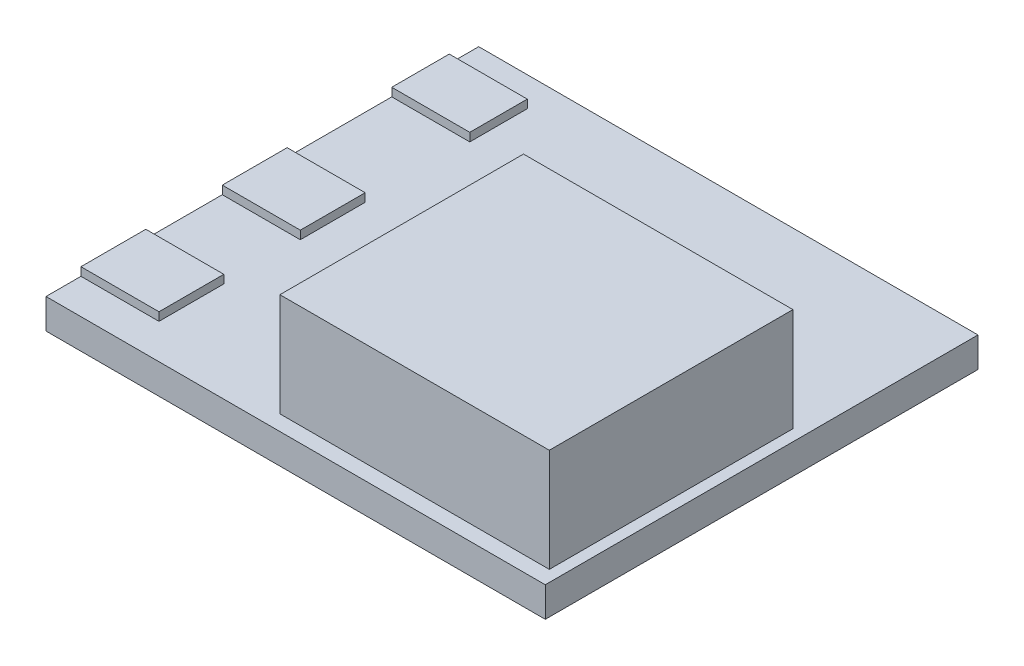
ISO-10303-21;
HEADER;
FILE_DESCRIPTION(('STEP AP214'),'2;1');
FILE_NAME('part.step','',(''),(''),'','','');
FILE_SCHEMA(('AUTOMOTIVE_DESIGN { 1 0 10303 214 1 1 1 1 }'));
ENDSEC;
DATA;
#1=APPLICATION_CONTEXT('core data for automotive mechanical design processes');
#2=APPLICATION_PROTOCOL_DEFINITION('international standard','automotive_design',2000,#1);
#3=PRODUCT_CONTEXT('',#1,'mechanical');
#4=PRODUCT('Part','Part','',(#3));
#5=PRODUCT_RELATED_PRODUCT_CATEGORY('part','',(#4));
#6=PRODUCT_DEFINITION_FORMATION('','',#4);
#7=PRODUCT_DEFINITION_CONTEXT('part definition',#1,'design');
#8=PRODUCT_DEFINITION('design','',#6,#7);
#9=PRODUCT_DEFINITION_SHAPE('','',#8);
#10=(LENGTH_UNIT() NAMED_UNIT(*) SI_UNIT(.MILLI.,.METRE.));
#11=(NAMED_UNIT(*) PLANE_ANGLE_UNIT() SI_UNIT($,.RADIAN.));
#12=(NAMED_UNIT(*) SI_UNIT($,.STERADIAN.) SOLID_ANGLE_UNIT());
#13=UNCERTAINTY_MEASURE_WITH_UNIT(LENGTH_MEASURE(1.E-05),#10,'distance_accuracy_value','');
#14=(GEOMETRIC_REPRESENTATION_CONTEXT(3) GLOBAL_UNCERTAINTY_ASSIGNED_CONTEXT((#13)) GLOBAL_UNIT_ASSIGNED_CONTEXT((#10,
#11,#12)) REPRESENTATION_CONTEXT('',''));
#15=CARTESIAN_POINT('',(0.,0.,0.));
#16=DIRECTION('',(0.,0.,1.));
#17=DIRECTION('',(1.,0.,0.));
#18=AXIS2_PLACEMENT_3D('',#15,#16,#17);
#19=CARTESIAN_POINT('',(0.,1.8,0.));
#20=DIRECTION('',(0.,1.,0.));
#21=DIRECTION('',(0.,0.,1.));
#22=AXIS2_PLACEMENT_3D('',#19,#20,#21);
#23=PLANE('',#22);
#24=DIRECTION('',(0.,0.,1.));
#25=VECTOR('',#24,1.);
#26=CARTESIAN_POINT('',(13.1340872374798,1.8,0.));
#27=LINE('',#26,#25);
#28=CARTESIAN_POINT('',(13.1340872374798,1.8,-15.5573505654281));
#29=VERTEX_POINT('',#28);
#30=CARTESIAN_POINT('',(13.1340872374798,1.8,-0.920840064620357));
#31=VERTEX_POINT('',#30);
#32=EDGE_CURVE('E289',#29,#31,#27,.T.);
#33=ORIENTED_EDGE('',*,*,#32,.F.);
#34=DIRECTION('',(1.,0.,0.));
#35=VECTOR('',#34,1.);
#36=CARTESIAN_POINT('',(0.,1.8,-15.5573505654281));
#37=LINE('',#36,#35);
#38=CARTESIAN_POINT('',(29.3214862681745,1.8,-15.5573505654281));
#39=VERTEX_POINT('',#38);
#40=EDGE_CURVE('E281',#29,#39,#37,.T.);
#41=ORIENTED_EDGE('',*,*,#40,.T.);
#42=DIRECTION('',(0.,0.,1.));
#43=VECTOR('',#42,1.);
#44=CARTESIAN_POINT('',(29.3214862681745,1.8,0.));
#45=LINE('',#44,#43);
#46=CARTESIAN_POINT('',(29.3214862681745,1.8,-0.920840064620357));
#47=VERTEX_POINT('',#46);
#48=EDGE_CURVE('E284',#39,#47,#45,.T.);
#49=ORIENTED_EDGE('',*,*,#48,.T.);
#50=DIRECTION('',(1.,0.,0.));
#51=VECTOR('',#50,1.);
#52=CARTESIAN_POINT('',(0.,1.8,-0.920840064620357));
#53=LINE('',#52,#51);
#54=EDGE_CURVE('E287',#31,#47,#53,.T.);
#55=ORIENTED_EDGE('',*,*,#54,.F.);
#56=EDGE_LOOP('',(#33,#41,#49,#55));
#57=FACE_BOUND('',#56,.T.);
#58=DIRECTION('',(0.,0.,-1.));
#59=VECTOR('',#58,1.);
#60=CARTESIAN_POINT('',(4.68829278157379,1.8,-24.2307542075907));
#61=LINE('',#60,#59);
#62=CARTESIAN_POINT('',(4.68829278157379,1.8,-20.775137528332));
#63=VERTEX_POINT('',#62);
#64=CARTESIAN_POINT('',(4.68829278157379,1.8,-24.2307542075907));
#65=VERTEX_POINT('',#64);
#66=EDGE_CURVE('E546',#63,#65,#61,.T.);
#67=ORIENTED_EDGE('',*,*,#66,.F.);
#68=DIRECTION('',(1.,0.,0.));
#69=VECTOR('',#68,1.);
#70=CARTESIAN_POINT('',(0.,1.8,-20.775137528332));
#71=LINE('',#70,#69);
#72=CARTESIAN_POINT('',(0.,1.8,-20.775137528332));
#73=VERTEX_POINT('',#72);
#74=EDGE_CURVE('E231',#73,#63,#71,.T.);
#75=ORIENTED_EDGE('',*,*,#74,.F.);
#76=DIRECTION('',(0.,0.,-1.));
#77=VECTOR('',#76,1.);
#78=CARTESIAN_POINT('',(0.,1.8,0.));
#79=LINE('',#78,#77);
#80=CARTESIAN_POINT('',(0.,1.8,-14.4888561224465));
#81=VERTEX_POINT('',#80);
#82=EDGE_CURVE('E205',#81,#73,#79,.T.);
#83=ORIENTED_EDGE('',*,*,#82,.F.);
#84=DIRECTION('',(-1.,0.,0.));
#85=VECTOR('',#84,1.);
#86=CARTESIAN_POINT('',(0.,1.8,-14.4888561224465));
#87=LINE('',#86,#85);
#88=CARTESIAN_POINT('',(4.68829278157379,1.8,-14.4888561224465));
#89=VERTEX_POINT('',#88);
#90=EDGE_CURVE('E224',#89,#81,#87,.T.);
#91=ORIENTED_EDGE('',*,*,#90,.F.);
#92=DIRECTION('',(0.,0.,-1.));
#93=VECTOR('',#92,1.);
#94=CARTESIAN_POINT('',(4.68829278157379,1.8,-14.4888561224465));
#95=LINE('',#94,#93);
#96=CARTESIAN_POINT('',(4.68829278157379,1.8,-10.5920968883889));
#97=VERTEX_POINT('',#96);
#98=EDGE_CURVE('E226',#97,#89,#95,.T.);
#99=ORIENTED_EDGE('',*,*,#98,.F.);
#100=DIRECTION('',(1.,0.,0.));
#101=VECTOR('',#100,1.);
#102=CARTESIAN_POINT('',(0.,1.8,-10.5920968883889));
#103=LINE('',#102,#101);
#104=CARTESIAN_POINT('',(0.,1.8,-10.5920968883889));
#105=VERTEX_POINT('',#104);
#106=EDGE_CURVE('E229',#105,#97,#103,.T.);
#107=ORIENTED_EDGE('',*,*,#106,.F.);
#108=CARTESIAN_POINT('',(0.,1.8,-5.99686194256615));
#109=VERTEX_POINT('',#108);
#110=EDGE_CURVE('E306',#109,#105,#79,.T.);
#111=ORIENTED_EDGE('',*,*,#110,.F.);
#112=DIRECTION('',(-1.,0.,0.));
#113=VECTOR('',#112,1.);
#114=CARTESIAN_POINT('',(0.,1.8,-5.99686194256615));
#115=LINE('',#114,#113);
#116=CARTESIAN_POINT('',(4.68829278157379,1.8,-5.99686194256615));
#117=VERTEX_POINT('',#116);
#118=EDGE_CURVE('E250',#117,#109,#115,.T.);
#119=ORIENTED_EDGE('',*,*,#118,.F.);
#120=DIRECTION('',(0.,0.,-1.));
#121=VECTOR('',#120,1.);
#122=CARTESIAN_POINT('',(4.68829278157379,1.8,-5.99686194256615));
#123=LINE('',#122,#121);
#124=CARTESIAN_POINT('',(4.68829278157379,1.8,-2.10010270850847));
#125=VERTEX_POINT('',#124);
#126=EDGE_CURVE('E252',#125,#117,#123,.T.);
#127=ORIENTED_EDGE('',*,*,#126,.F.);
#128=DIRECTION('',(1.,0.,0.));
#129=VECTOR('',#128,1.);
#130=CARTESIAN_POINT('',(0.,1.8,-2.10010270850847));
#131=LINE('',#130,#129);
#132=CARTESIAN_POINT('',(0.,1.8,-2.10010270850847));
#133=VERTEX_POINT('',#132);
#134=EDGE_CURVE('E217',#133,#125,#131,.T.);
#135=ORIENTED_EDGE('',*,*,#134,.F.);
#136=CARTESIAN_POINT('',(0.,1.8,0.));
#137=VERTEX_POINT('',#136);
#138=EDGE_CURVE('E302',#137,#133,#79,.T.);
#139=ORIENTED_EDGE('',*,*,#138,.F.);
#140=DIRECTION('',(1.,0.,0.));
#141=VECTOR('',#140,1.);
#142=CARTESIAN_POINT('',(0.,1.8,0.));
#143=LINE('',#142,#141);
#144=CARTESIAN_POINT('',(30.,1.8,0.));
#145=VERTEX_POINT('',#144);
#146=EDGE_CURVE('E292',#137,#145,#143,.T.);
#147=ORIENTED_EDGE('',*,*,#146,.T.);
#148=DIRECTION('',(0.,0.,-1.));
#149=VECTOR('',#148,1.);
#150=CARTESIAN_POINT('',(30.,1.8,0.));
#151=LINE('',#150,#149);
#152=CARTESIAN_POINT('',(30.,1.8,-26.));
#153=VERTEX_POINT('',#152);
#154=EDGE_CURVE('E295',#145,#153,#151,.T.);
#155=ORIENTED_EDGE('',*,*,#154,.T.);
#156=DIRECTION('',(1.,0.,0.));
#157=VECTOR('',#156,1.);
#158=CARTESIAN_POINT('',(0.,1.8,-26.));
#159=LINE('',#158,#157);
#160=CARTESIAN_POINT('',(0.,1.8,-26.));
#161=VERTEX_POINT('',#160);
#162=EDGE_CURVE('E298',#161,#153,#159,.T.);
#163=ORIENTED_EDGE('',*,*,#162,.F.);
#164=CARTESIAN_POINT('',(0.,1.8,-24.2307542075907));
#165=VERTEX_POINT('',#164);
#166=EDGE_CURVE('E301',#165,#161,#79,.T.);
#167=ORIENTED_EDGE('',*,*,#166,.F.);
#168=DIRECTION('',(-1.,0.,0.));
#169=VECTOR('',#168,1.);
#170=CARTESIAN_POINT('',(0.,1.8,-24.2307542075907));
#171=LINE('',#170,#169);
#172=EDGE_CURVE('E198',#65,#165,#171,.T.);
#173=ORIENTED_EDGE('',*,*,#172,.F.);
#174=EDGE_LOOP('',(#67,#75,#83,#91,#99,#107,#111,#119,#127,#135,#139,#147,#155,#163,#167,#173));
#175=FACE_BOUND('',#174,.T.);
#176=ADVANCED_FACE('F41',(#57,#175),#23,.T.);
#177=CARTESIAN_POINT('',(0.,1.8,0.));
#178=DIRECTION('',(0.,0.,-1.));
#179=DIRECTION('',(-1.,0.,0.));
#180=AXIS2_PLACEMENT_3D('',#177,#178,#179);
#181=PLANE('',#180);
#182=DIRECTION('',(1.,0.,0.));
#183=VECTOR('',#182,1.);
#184=CARTESIAN_POINT('',(0.,0.,0.));
#185=LINE('',#184,#183);
#186=CARTESIAN_POINT('',(0.,0.,0.));
#187=VERTEX_POINT('',#186);
#188=CARTESIAN_POINT('',(30.,0.,0.));
#189=VERTEX_POINT('',#188);
#190=EDGE_CURVE('E291',#187,#189,#185,.T.);
#191=ORIENTED_EDGE('',*,*,#190,.T.);
#192=DIRECTION('',(0.,-1.,0.));
#193=VECTOR('',#192,1.);
#194=CARTESIAN_POINT('',(30.,1.8,0.));
#195=LINE('',#194,#193);
#196=EDGE_CURVE('E11',#145,#189,#195,.T.);
#197=ORIENTED_EDGE('',*,*,#196,.F.);
#198=ORIENTED_EDGE('',*,*,#146,.F.);
#199=DIRECTION('',(0.,-1.,0.));
#200=VECTOR('',#199,1.);
#201=CARTESIAN_POINT('',(0.,1.8,0.));
#202=LINE('',#201,#200);
#203=EDGE_CURVE('E305',#137,#187,#202,.T.);
#204=ORIENTED_EDGE('',*,*,#203,.T.);
#205=EDGE_LOOP('',(#191,#197,#198,#204));
#206=FACE_BOUND('',#205,.T.);
#207=ADVANCED_FACE('F43',(#206),#181,.F.);
#208=CARTESIAN_POINT('',(30.,1.8,0.));
#209=DIRECTION('',(-1.,0.,0.));
#210=DIRECTION('',(0.,0.,1.));
#211=AXIS2_PLACEMENT_3D('',#208,#209,#210);
#212=PLANE('',#211);
#213=DIRECTION('',(0.,0.,-1.));
#214=VECTOR('',#213,1.);
#215=CARTESIAN_POINT('',(30.,0.,0.));
#216=LINE('',#215,#214);
#217=CARTESIAN_POINT('',(30.,0.,-26.));
#218=VERTEX_POINT('',#217);
#219=EDGE_CURVE('E309',#189,#218,#216,.T.);
#220=ORIENTED_EDGE('',*,*,#219,.T.);
#221=DIRECTION('',(0.,-1.,0.));
#222=VECTOR('',#221,1.);
#223=CARTESIAN_POINT('',(30.,1.8,-26.));
#224=LINE('',#223,#222);
#225=EDGE_CURVE('E49',#153,#218,#224,.T.);
#226=ORIENTED_EDGE('',*,*,#225,.F.);
#227=ORIENTED_EDGE('',*,*,#154,.F.);
#228=ORIENTED_EDGE('',*,*,#196,.T.);
#229=EDGE_LOOP('',(#220,#226,#227,#228));
#230=FACE_BOUND('',#229,.T.);
#231=ADVANCED_FACE('F326',(#230),#212,.F.);
#232=CARTESIAN_POINT('',(0.,1.8,-26.));
#233=DIRECTION('',(0.,0.,-1.));
#234=DIRECTION('',(-1.,0.,0.));
#235=AXIS2_PLACEMENT_3D('',#232,#233,#234);
#236=PLANE('',#235);
#237=DIRECTION('',(1.,0.,0.));
#238=VECTOR('',#237,1.);
#239=CARTESIAN_POINT('',(0.,0.,-26.));
#240=LINE('',#239,#238);
#241=CARTESIAN_POINT('',(0.,0.,-26.));
#242=VERTEX_POINT('',#241);
#243=EDGE_CURVE('E312',#242,#218,#240,.T.);
#244=ORIENTED_EDGE('',*,*,#243,.F.);
#245=DIRECTION('',(0.,-1.,0.));
#246=VECTOR('',#245,1.);
#247=CARTESIAN_POINT('',(0.,1.8,-26.));
#248=LINE('',#247,#246);
#249=EDGE_CURVE('E318',#161,#242,#248,.T.);
#250=ORIENTED_EDGE('',*,*,#249,.F.);
#251=ORIENTED_EDGE('',*,*,#162,.T.);
#252=ORIENTED_EDGE('',*,*,#225,.T.);
#253=EDGE_LOOP('',(#244,#250,#251,#252));
#254=FACE_BOUND('',#253,.T.);
#255=ADVANCED_FACE('F322',(#254),#236,.T.);
#256=CARTESIAN_POINT('',(0.,1.8,0.));
#257=DIRECTION('',(-1.,0.,0.));
#258=DIRECTION('',(0.,0.,1.));
#259=AXIS2_PLACEMENT_3D('',#256,#257,#258);
#260=PLANE('',#259);
#261=DIRECTION('',(0.,0.,-1.));
#262=VECTOR('',#261,1.);
#263=CARTESIAN_POINT('',(0.,0.,0.));
#264=LINE('',#263,#262);
#265=EDGE_CURVE('E296',#187,#242,#264,.T.);
#266=ORIENTED_EDGE('',*,*,#265,.F.);
#267=ORIENTED_EDGE('',*,*,#203,.F.);
#268=ORIENTED_EDGE('',*,*,#138,.T.);
#269=DIRECTION('',(0.,-1.,0.));
#270=VECTOR('',#269,1.);
#271=CARTESIAN_POINT('',(0.,2.3,-2.10010270850847));
#272=LINE('',#271,#270);
#273=CARTESIAN_POINT('',(0.,2.3,-2.10010270850847));
#274=VERTEX_POINT('',#273);
#275=EDGE_CURVE('E239',#274,#133,#272,.T.);
#276=ORIENTED_EDGE('',*,*,#275,.F.);
#277=DIRECTION('',(0.,0.,1.));
#278=VECTOR('',#277,1.);
#279=CARTESIAN_POINT('',(0.,2.3,-5.99686194256615));
#280=LINE('',#279,#278);
#281=CARTESIAN_POINT('',(0.,2.3,-5.99686194256615));
#282=VERTEX_POINT('',#281);
#283=EDGE_CURVE('E253',#282,#274,#280,.T.);
#284=ORIENTED_EDGE('',*,*,#283,.F.);
#285=DIRECTION('',(0.,-1.,0.));
#286=VECTOR('',#285,1.);
#287=CARTESIAN_POINT('',(0.,2.3,-5.99686194256615));
#288=LINE('',#287,#286);
#289=EDGE_CURVE('E246',#282,#109,#288,.T.);
#290=ORIENTED_EDGE('',*,*,#289,.T.);
#291=ORIENTED_EDGE('',*,*,#110,.T.);
#292=DIRECTION('',(0.,-1.,0.));
#293=VECTOR('',#292,1.);
#294=CARTESIAN_POINT('',(0.,2.3,-10.5920968883889));
#295=LINE('',#294,#293);
#296=CARTESIAN_POINT('',(0.,2.3,-10.5920968883889));
#297=VERTEX_POINT('',#296);
#298=EDGE_CURVE('E214',#297,#105,#295,.T.);
#299=ORIENTED_EDGE('',*,*,#298,.F.);
#300=DIRECTION('',(0.,0.,1.));
#301=VECTOR('',#300,1.);
#302=CARTESIAN_POINT('',(0.,2.3,-14.4888561224465));
#303=LINE('',#302,#301);
#304=CARTESIAN_POINT('',(0.,2.3,-14.4888561224465));
#305=VERTEX_POINT('',#304);
#306=EDGE_CURVE('E227',#305,#297,#303,.T.);
#307=ORIENTED_EDGE('',*,*,#306,.F.);
#308=DIRECTION('',(0.,-1.,0.));
#309=VECTOR('',#308,1.);
#310=CARTESIAN_POINT('',(0.,2.3,-14.4888561224465));
#311=LINE('',#310,#309);
#312=EDGE_CURVE('E221',#305,#81,#311,.T.);
#313=ORIENTED_EDGE('',*,*,#312,.T.);
#314=ORIENTED_EDGE('',*,*,#82,.T.);
#315=DIRECTION('',(0.,-1.,0.));
#316=VECTOR('',#315,1.);
#317=CARTESIAN_POINT('',(0.,2.3,-20.775137528332));
#318=LINE('',#317,#316);
#319=CARTESIAN_POINT('',(0.,2.3,-20.775137528332));
#320=VERTEX_POINT('',#319);
#321=EDGE_CURVE('E183',#320,#73,#318,.T.);
#322=ORIENTED_EDGE('',*,*,#321,.F.);
#323=DIRECTION('',(0.,0.,1.));
#324=VECTOR('',#323,1.);
#325=CARTESIAN_POINT('',(0.,2.3,-24.2307542075907));
#326=LINE('',#325,#324);
#327=CARTESIAN_POINT('',(0.,2.3,-24.2307542075907));
#328=VERTEX_POINT('',#327);
#329=EDGE_CURVE('E190',#328,#320,#326,.T.);
#330=ORIENTED_EDGE('',*,*,#329,.F.);
#331=DIRECTION('',(0.,-1.,0.));
#332=VECTOR('',#331,1.);
#333=CARTESIAN_POINT('',(0.,2.3,-24.2307542075907));
#334=LINE('',#333,#332);
#335=EDGE_CURVE('E545',#328,#165,#334,.T.);
#336=ORIENTED_EDGE('',*,*,#335,.T.);
#337=ORIENTED_EDGE('',*,*,#166,.T.);
#338=ORIENTED_EDGE('',*,*,#249,.T.);
#339=EDGE_LOOP('',(#266,#267,#268,#276,#284,#290,#291,#299,#307,#313,#314,#322,#330,#336,#337,#338));
#340=FACE_BOUND('',#339,.T.);
#341=ADVANCED_FACE('F202',(#340),#260,.T.);
#342=CARTESIAN_POINT('',(0.,0.,0.));
#343=DIRECTION('',(0.,1.,0.));
#344=DIRECTION('',(0.,0.,1.));
#345=AXIS2_PLACEMENT_3D('',#342,#343,#344);
#346=PLANE('',#345);
#347=ORIENTED_EDGE('',*,*,#190,.F.);
#348=ORIENTED_EDGE('',*,*,#265,.T.);
#349=ORIENTED_EDGE('',*,*,#243,.T.);
#350=ORIENTED_EDGE('',*,*,#219,.F.);
#351=EDGE_LOOP('',(#347,#348,#349,#350));
#352=FACE_BOUND('',#351,.T.);
#353=ADVANCED_FACE('F330',(#352),#346,.F.);
#354=CARTESIAN_POINT('',(13.1340872374798,8.,0.));
#355=DIRECTION('',(-1.,0.,0.));
#356=DIRECTION('',(0.,0.,1.));
#357=AXIS2_PLACEMENT_3D('',#354,#355,#356);
#358=PLANE('',#357);
#359=DIRECTION('',(0.,-1.,0.));
#360=VECTOR('',#359,1.);
#361=CARTESIAN_POINT('',(13.1340872374798,8.,-15.5573505654281));
#362=LINE('',#361,#360);
#363=CARTESIAN_POINT('',(13.1340872374798,8.,-15.5573505654281));
#364=VERTEX_POINT('',#363);
#365=EDGE_CURVE('E270',#364,#29,#362,.T.);
#366=ORIENTED_EDGE('',*,*,#365,.T.);
#367=ORIENTED_EDGE('',*,*,#32,.T.);
#368=DIRECTION('',(0.,-1.,0.));
#369=VECTOR('',#368,1.);
#370=CARTESIAN_POINT('',(13.1340872374798,8.,-0.920840064620357));
#371=LINE('',#370,#369);
#372=CARTESIAN_POINT('',(13.1340872374798,8.,-0.920840064620357));
#373=VERTEX_POINT('',#372);
#374=EDGE_CURVE('E278',#373,#31,#371,.T.);
#375=ORIENTED_EDGE('',*,*,#374,.F.);
#376=DIRECTION('',(0.,0.,-1.));
#377=VECTOR('',#376,1.);
#378=CARTESIAN_POINT('',(13.1340872374798,8.,0.));
#379=LINE('',#378,#377);
#380=EDGE_CURVE('E206',#373,#364,#379,.T.);
#381=ORIENTED_EDGE('',*,*,#380,.T.);
#382=EDGE_LOOP('',(#366,#367,#375,#381));
#383=FACE_BOUND('',#382,.T.);
#384=ADVANCED_FACE('F353',(#383),#358,.T.);
#385=CARTESIAN_POINT('',(0.,8.,-0.920840064620357));
#386=DIRECTION('',(0.,0.,1.));
#387=DIRECTION('',(1.,0.,0.));
#388=AXIS2_PLACEMENT_3D('',#385,#386,#387);
#389=PLANE('',#388);
#390=ORIENTED_EDGE('',*,*,#374,.T.);
#391=ORIENTED_EDGE('',*,*,#54,.T.);
#392=DIRECTION('',(0.,-1.,0.));
#393=VECTOR('',#392,1.);
#394=CARTESIAN_POINT('',(29.3214862681745,8.,-0.920840064620357));
#395=LINE('',#394,#393);
#396=CARTESIAN_POINT('',(29.3214862681745,8.,-0.920840064620357));
#397=VERTEX_POINT('',#396);
#398=EDGE_CURVE('E275',#397,#47,#395,.T.);
#399=ORIENTED_EDGE('',*,*,#398,.F.);
#400=DIRECTION('',(-1.,0.,0.));
#401=VECTOR('',#400,1.);
#402=CARTESIAN_POINT('',(0.,8.,-0.920840064620357));
#403=LINE('',#402,#401);
#404=EDGE_CURVE('E209',#397,#373,#403,.T.);
#405=ORIENTED_EDGE('',*,*,#404,.T.);
#406=EDGE_LOOP('',(#390,#391,#399,#405));
#407=FACE_BOUND('',#406,.T.);
#408=ADVANCED_FACE('F376',(#407),#389,.T.);
#409=CARTESIAN_POINT('',(29.3214862681745,8.,0.));
#410=DIRECTION('',(-1.,0.,0.));
#411=DIRECTION('',(0.,0.,1.));
#412=AXIS2_PLACEMENT_3D('',#409,#410,#411);
#413=PLANE('',#412);
#414=ORIENTED_EDGE('',*,*,#48,.F.);
#415=DIRECTION('',(0.,-1.,0.));
#416=VECTOR('',#415,1.);
#417=CARTESIAN_POINT('',(29.3214862681745,8.,-15.5573505654281));
#418=LINE('',#417,#416);
#419=CARTESIAN_POINT('',(29.3214862681745,8.,-15.5573505654281));
#420=VERTEX_POINT('',#419);
#421=EDGE_CURVE('E273',#420,#39,#418,.T.);
#422=ORIENTED_EDGE('',*,*,#421,.F.);
#423=DIRECTION('',(0.,0.,-1.));
#424=VECTOR('',#423,1.);
#425=CARTESIAN_POINT('',(29.3214862681745,8.,0.));
#426=LINE('',#425,#424);
#427=EDGE_CURVE('E266',#397,#420,#426,.T.);
#428=ORIENTED_EDGE('',*,*,#427,.F.);
#429=ORIENTED_EDGE('',*,*,#398,.T.);
#430=EDGE_LOOP('',(#414,#422,#428,#429));
#431=FACE_BOUND('',#430,.T.);
#432=ADVANCED_FACE('F384',(#431),#413,.F.);
#433=CARTESIAN_POINT('',(0.,8.,-15.5573505654281));
#434=DIRECTION('',(0.,0.,1.));
#435=DIRECTION('',(1.,0.,0.));
#436=AXIS2_PLACEMENT_3D('',#433,#434,#435);
#437=PLANE('',#436);
#438=ORIENTED_EDGE('',*,*,#40,.F.);
#439=ORIENTED_EDGE('',*,*,#365,.F.);
#440=DIRECTION('',(-1.,0.,0.));
#441=VECTOR('',#440,1.);
#442=CARTESIAN_POINT('',(0.,8.,-15.5573505654281));
#443=LINE('',#442,#441);
#444=EDGE_CURVE('E268',#420,#364,#443,.T.);
#445=ORIENTED_EDGE('',*,*,#444,.F.);
#446=ORIENTED_EDGE('',*,*,#421,.T.);
#447=EDGE_LOOP('',(#438,#439,#445,#446));
#448=FACE_BOUND('',#447,.T.);
#449=ADVANCED_FACE('F392',(#448),#437,.F.);
#450=CARTESIAN_POINT('',(0.,8.,0.));
#451=DIRECTION('',(0.,1.,0.));
#452=DIRECTION('',(0.,0.,1.));
#453=AXIS2_PLACEMENT_3D('',#450,#451,#452);
#454=PLANE('',#453);
#455=ORIENTED_EDGE('',*,*,#380,.F.);
#456=ORIENTED_EDGE('',*,*,#404,.F.);
#457=ORIENTED_EDGE('',*,*,#427,.T.);
#458=ORIENTED_EDGE('',*,*,#444,.T.);
#459=EDGE_LOOP('',(#455,#456,#457,#458));
#460=FACE_BOUND('',#459,.T.);
#461=ADVANCED_FACE('F400',(#460),#454,.T.);
#462=CARTESIAN_POINT('',(0.,2.3,-2.10010270850847));
#463=DIRECTION('',(0.,0.,-1.));
#464=DIRECTION('',(-1.,0.,0.));
#465=AXIS2_PLACEMENT_3D('',#462,#463,#464);
#466=PLANE('',#465);
#467=ORIENTED_EDGE('',*,*,#134,.T.);
#468=DIRECTION('',(0.,-1.,0.));
#469=VECTOR('',#468,1.);
#470=CARTESIAN_POINT('',(4.68829278157379,2.3,-2.10010270850847));
#471=LINE('',#470,#469);
#472=CARTESIAN_POINT('',(4.68829278157379,2.3,-2.10010270850847));
#473=VERTEX_POINT('',#472);
#474=EDGE_CURVE('E241',#473,#125,#471,.T.);
#475=ORIENTED_EDGE('',*,*,#474,.F.);
#476=DIRECTION('',(1.,0.,0.));
#477=VECTOR('',#476,1.);
#478=CARTESIAN_POINT('',(0.,2.3,-2.10010270850847));
#479=LINE('',#478,#477);
#480=EDGE_CURVE('E260',#274,#473,#479,.T.);
#481=ORIENTED_EDGE('',*,*,#480,.F.);
#482=ORIENTED_EDGE('',*,*,#275,.T.);
#483=EDGE_LOOP('',(#467,#475,#481,#482));
#484=FACE_BOUND('',#483,.T.);
#485=ADVANCED_FACE('F408',(#484),#466,.F.);
#486=CARTESIAN_POINT('',(4.68829278157379,2.3,-5.99686194256615));
#487=DIRECTION('',(-1.,0.,0.));
#488=DIRECTION('',(0.,0.,1.));
#489=AXIS2_PLACEMENT_3D('',#486,#487,#488);
#490=PLANE('',#489);
#491=ORIENTED_EDGE('',*,*,#126,.T.);
#492=DIRECTION('',(0.,-1.,0.));
#493=VECTOR('',#492,1.);
#494=CARTESIAN_POINT('',(4.68829278157379,2.3,-5.99686194256615));
#495=LINE('',#494,#493);
#496=CARTESIAN_POINT('',(4.68829278157379,2.3,-5.99686194256615));
#497=VERTEX_POINT('',#496);
#498=EDGE_CURVE('E244',#497,#117,#495,.T.);
#499=ORIENTED_EDGE('',*,*,#498,.F.);
#500=DIRECTION('',(0.,0.,-1.));
#501=VECTOR('',#500,1.);
#502=CARTESIAN_POINT('',(4.68829278157379,2.3,-5.99686194256615));
#503=LINE('',#502,#501);
#504=EDGE_CURVE('E258',#473,#497,#503,.T.);
#505=ORIENTED_EDGE('',*,*,#504,.F.);
#506=ORIENTED_EDGE('',*,*,#474,.T.);
#507=EDGE_LOOP('',(#491,#499,#505,#506));
#508=FACE_BOUND('',#507,.T.);
#509=ADVANCED_FACE('F438',(#508),#490,.F.);
#510=CARTESIAN_POINT('',(0.,2.3,-5.99686194256615));
#511=DIRECTION('',(0.,0.,1.));
#512=DIRECTION('',(1.,0.,0.));
#513=AXIS2_PLACEMENT_3D('',#510,#511,#512);
#514=PLANE('',#513);
#515=ORIENTED_EDGE('',*,*,#118,.T.);
#516=ORIENTED_EDGE('',*,*,#289,.F.);
#517=DIRECTION('',(-1.,0.,0.));
#518=VECTOR('',#517,1.);
#519=CARTESIAN_POINT('',(0.,2.3,-5.99686194256615));
#520=LINE('',#519,#518);
#521=EDGE_CURVE('E249',#497,#282,#520,.T.);
#522=ORIENTED_EDGE('',*,*,#521,.F.);
#523=ORIENTED_EDGE('',*,*,#498,.T.);
#524=EDGE_LOOP('',(#515,#516,#522,#523));
#525=FACE_BOUND('',#524,.T.);
#526=ADVANCED_FACE('F448',(#525),#514,.F.);
#527=CARTESIAN_POINT('',(0.,2.3,0.));
#528=DIRECTION('',(0.,1.,0.));
#529=DIRECTION('',(0.,0.,1.));
#530=AXIS2_PLACEMENT_3D('',#527,#528,#529);
#531=PLANE('',#530);
#532=ORIENTED_EDGE('',*,*,#283,.T.);
#533=ORIENTED_EDGE('',*,*,#480,.T.);
#534=ORIENTED_EDGE('',*,*,#504,.T.);
#535=ORIENTED_EDGE('',*,*,#521,.T.);
#536=EDGE_LOOP('',(#532,#533,#534,#535));
#537=FACE_BOUND('',#536,.T.);
#538=ADVANCED_FACE('F458',(#537),#531,.T.);
#539=CARTESIAN_POINT('',(0.,2.3,-10.5920968883889));
#540=DIRECTION('',(0.,0.,-1.));
#541=DIRECTION('',(-1.,0.,0.));
#542=AXIS2_PLACEMENT_3D('',#539,#540,#541);
#543=PLANE('',#542);
#544=ORIENTED_EDGE('',*,*,#106,.T.);
#545=DIRECTION('',(0.,-1.,0.));
#546=VECTOR('',#545,1.);
#547=CARTESIAN_POINT('',(4.68829278157379,2.3,-10.5920968883889));
#548=LINE('',#547,#546);
#549=CARTESIAN_POINT('',(4.68829278157379,2.3,-10.5920968883889));
#550=VERTEX_POINT('',#549);
#551=EDGE_CURVE('E216',#550,#97,#548,.T.);
#552=ORIENTED_EDGE('',*,*,#551,.F.);
#553=DIRECTION('',(1.,0.,0.));
#554=VECTOR('',#553,1.);
#555=CARTESIAN_POINT('',(0.,2.3,-10.5920968883889));
#556=LINE('',#555,#554);
#557=EDGE_CURVE('E235',#297,#550,#556,.T.);
#558=ORIENTED_EDGE('',*,*,#557,.F.);
#559=ORIENTED_EDGE('',*,*,#298,.T.);
#560=EDGE_LOOP('',(#544,#552,#558,#559));
#561=FACE_BOUND('',#560,.T.);
#562=ADVANCED_FACE('F468',(#561),#543,.F.);
#563=CARTESIAN_POINT('',(4.68829278157379,2.3,-14.4888561224465));
#564=DIRECTION('',(-1.,0.,0.));
#565=DIRECTION('',(0.,0.,1.));
#566=AXIS2_PLACEMENT_3D('',#563,#564,#565);
#567=PLANE('',#566);
#568=ORIENTED_EDGE('',*,*,#98,.T.);
#569=DIRECTION('',(0.,-1.,0.));
#570=VECTOR('',#569,1.);
#571=CARTESIAN_POINT('',(4.68829278157379,2.3,-14.4888561224465));
#572=LINE('',#571,#570);
#573=CARTESIAN_POINT('',(4.68829278157379,2.3,-14.4888561224465));
#574=VERTEX_POINT('',#573);
#575=EDGE_CURVE('E64',#574,#89,#572,.T.);
#576=ORIENTED_EDGE('',*,*,#575,.F.);
#577=DIRECTION('',(0.,0.,-1.));
#578=VECTOR('',#577,1.);
#579=CARTESIAN_POINT('',(4.68829278157379,2.3,-14.4888561224465));
#580=LINE('',#579,#578);
#581=EDGE_CURVE('E233',#550,#574,#580,.T.);
#582=ORIENTED_EDGE('',*,*,#581,.F.);
#583=ORIENTED_EDGE('',*,*,#551,.T.);
#584=EDGE_LOOP('',(#568,#576,#582,#583));
#585=FACE_BOUND('',#584,.T.);
#586=ADVANCED_FACE('F478',(#585),#567,.F.);
#587=CARTESIAN_POINT('',(0.,2.3,-14.4888561224465));
#588=DIRECTION('',(0.,0.,1.));
#589=DIRECTION('',(1.,0.,0.));
#590=AXIS2_PLACEMENT_3D('',#587,#588,#589);
#591=PLANE('',#590);
#592=ORIENTED_EDGE('',*,*,#90,.T.);
#593=ORIENTED_EDGE('',*,*,#312,.F.);
#594=DIRECTION('',(-1.,0.,0.));
#595=VECTOR('',#594,1.);
#596=CARTESIAN_POINT('',(0.,2.3,-14.4888561224465));
#597=LINE('',#596,#595);
#598=EDGE_CURVE('E223',#574,#305,#597,.T.);
#599=ORIENTED_EDGE('',*,*,#598,.F.);
#600=ORIENTED_EDGE('',*,*,#575,.T.);
#601=EDGE_LOOP('',(#592,#593,#599,#600));
#602=FACE_BOUND('',#601,.T.);
#603=ADVANCED_FACE('F488',(#602),#591,.F.);
#604=CARTESIAN_POINT('',(0.,2.3,0.));
#605=DIRECTION('',(0.,1.,0.));
#606=DIRECTION('',(0.,0.,1.));
#607=AXIS2_PLACEMENT_3D('',#604,#605,#606);
#608=PLANE('',#607);
#609=ORIENTED_EDGE('',*,*,#306,.T.);
#610=ORIENTED_EDGE('',*,*,#557,.T.);
#611=ORIENTED_EDGE('',*,*,#581,.T.);
#612=ORIENTED_EDGE('',*,*,#598,.T.);
#613=EDGE_LOOP('',(#609,#610,#611,#612));
#614=FACE_BOUND('',#613,.T.);
#615=ADVANCED_FACE('F498',(#614),#608,.T.);
#616=CARTESIAN_POINT('',(0.,2.3,-20.775137528332));
#617=DIRECTION('',(0.,0.,-1.));
#618=DIRECTION('',(-1.,0.,0.));
#619=AXIS2_PLACEMENT_3D('',#616,#617,#618);
#620=PLANE('',#619);
#621=ORIENTED_EDGE('',*,*,#74,.T.);
#622=DIRECTION('',(0.,-1.,0.));
#623=VECTOR('',#622,1.);
#624=CARTESIAN_POINT('',(4.68829278157379,2.3,-20.775137528332));
#625=LINE('',#624,#623);
#626=CARTESIAN_POINT('',(4.68829278157379,2.3,-20.775137528332));
#627=VERTEX_POINT('',#626);
#628=EDGE_CURVE('E186',#627,#63,#625,.T.);
#629=ORIENTED_EDGE('',*,*,#628,.F.);
#630=DIRECTION('',(1.,0.,0.));
#631=VECTOR('',#630,1.);
#632=CARTESIAN_POINT('',(0.,2.3,-20.775137528332));
#633=LINE('',#632,#631);
#634=EDGE_CURVE('E179',#320,#627,#633,.T.);
#635=ORIENTED_EDGE('',*,*,#634,.F.);
#636=ORIENTED_EDGE('',*,*,#321,.T.);
#637=EDGE_LOOP('',(#621,#629,#635,#636));
#638=FACE_BOUND('',#637,.T.);
#639=ADVANCED_FACE('F181',(#638),#620,.F.);
#640=CARTESIAN_POINT('',(4.68829278157379,2.3,-24.2307542075907));
#641=DIRECTION('',(-1.,0.,0.));
#642=DIRECTION('',(0.,0.,1.));
#643=AXIS2_PLACEMENT_3D('',#640,#641,#642);
#644=PLANE('',#643);
#645=ORIENTED_EDGE('',*,*,#66,.T.);
#646=DIRECTION('',(0.,-1.,0.));
#647=VECTOR('',#646,1.);
#648=CARTESIAN_POINT('',(4.68829278157379,2.3,-24.2307542075907));
#649=LINE('',#648,#647);
#650=CARTESIAN_POINT('',(4.68829278157379,2.3,-24.2307542075907));
#651=VERTEX_POINT('',#650);
#652=EDGE_CURVE('E56',#651,#65,#649,.T.);
#653=ORIENTED_EDGE('',*,*,#652,.F.);
#654=DIRECTION('',(0.,0.,-1.));
#655=VECTOR('',#654,1.);
#656=CARTESIAN_POINT('',(4.68829278157379,2.3,-24.2307542075907));
#657=LINE('',#656,#655);
#658=EDGE_CURVE('E189',#627,#651,#657,.T.);
#659=ORIENTED_EDGE('',*,*,#658,.F.);
#660=ORIENTED_EDGE('',*,*,#628,.T.);
#661=EDGE_LOOP('',(#645,#653,#659,#660));
#662=FACE_BOUND('',#661,.T.);
#663=ADVANCED_FACE('F516',(#662),#644,.F.);
#664=CARTESIAN_POINT('',(0.,2.3,-24.2307542075907));
#665=DIRECTION('',(0.,0.,1.));
#666=DIRECTION('',(1.,0.,0.));
#667=AXIS2_PLACEMENT_3D('',#664,#665,#666);
#668=PLANE('',#667);
#669=ORIENTED_EDGE('',*,*,#172,.T.);
#670=ORIENTED_EDGE('',*,*,#335,.F.);
#671=DIRECTION('',(-1.,0.,0.));
#672=VECTOR('',#671,1.);
#673=CARTESIAN_POINT('',(0.,2.3,-24.2307542075907));
#674=LINE('',#673,#672);
#675=EDGE_CURVE('E194',#651,#328,#674,.T.);
#676=ORIENTED_EDGE('',*,*,#675,.F.);
#677=ORIENTED_EDGE('',*,*,#652,.T.);
#678=EDGE_LOOP('',(#669,#670,#676,#677));
#679=FACE_BOUND('',#678,.T.);
#680=ADVANCED_FACE('F525',(#679),#668,.F.);
#681=CARTESIAN_POINT('',(0.,2.3,0.));
#682=DIRECTION('',(0.,1.,0.));
#683=DIRECTION('',(0.,0.,1.));
#684=AXIS2_PLACEMENT_3D('',#681,#682,#683);
#685=PLANE('',#684);
#686=ORIENTED_EDGE('',*,*,#329,.T.);
#687=ORIENTED_EDGE('',*,*,#634,.T.);
#688=ORIENTED_EDGE('',*,*,#658,.T.);
#689=ORIENTED_EDGE('',*,*,#675,.T.);
#690=EDGE_LOOP('',(#686,#687,#688,#689));
#691=FACE_BOUND('',#690,.T.);
#692=ADVANCED_FACE('F193',(#691),#685,.T.);
#693=CLOSED_SHELL('',(#176,#207,#231,#255,#341,#353,#384,#408,#432,#449,#461,#485,#509,#526,
#538,#562,#586,#603,#615,#639,#663,#680,#692));
#694=MANIFOLD_SOLID_BREP('B2',#693);
#695=ADVANCED_BREP_SHAPE_REPRESENTATION('',(#18,#694),#14);
#696=SHAPE_DEFINITION_REPRESENTATION(#9,#695);
ENDSEC;
END-ISO-10303-21;
